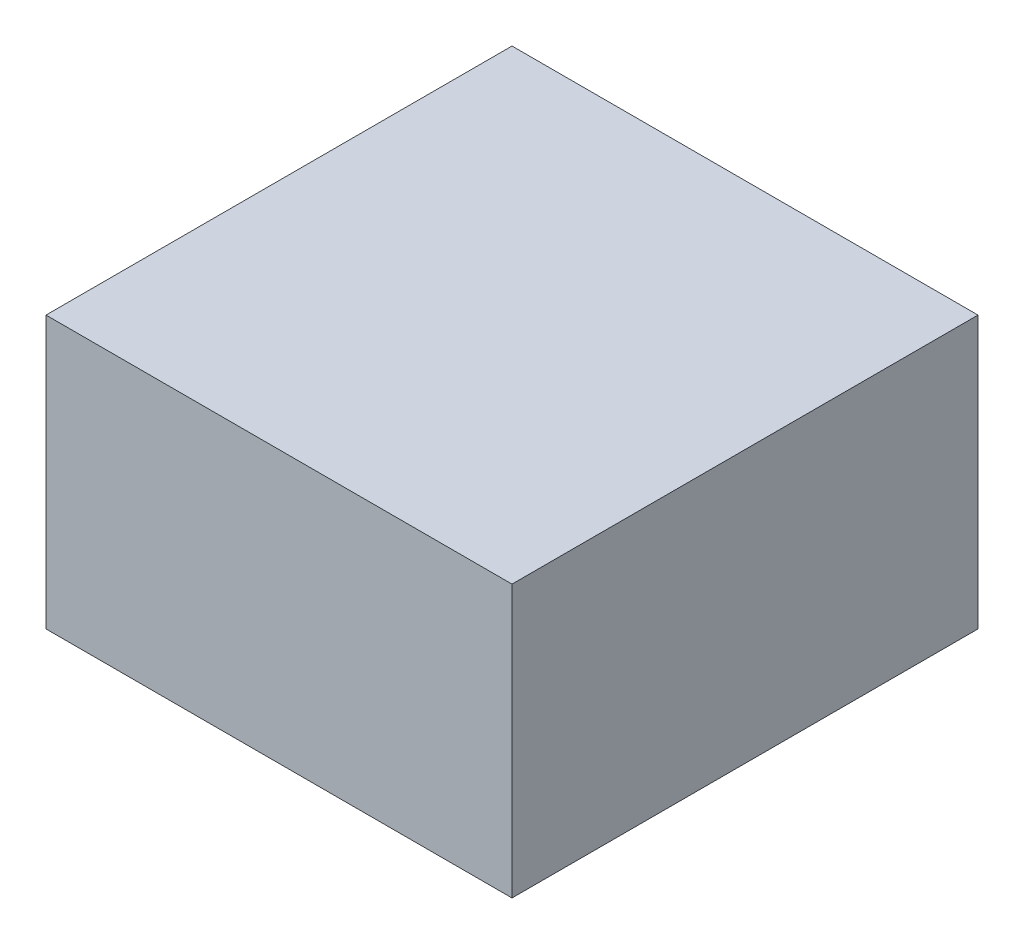
ISO-10303-21;
HEADER;
FILE_DESCRIPTION(('STEP AP214'),'2;1');
FILE_NAME('part.step','',(''),(''),'','','');
FILE_SCHEMA(('AUTOMOTIVE_DESIGN { 1 0 10303 214 1 1 1 1 }'));
ENDSEC;
DATA;
#1=APPLICATION_CONTEXT('core data for automotive mechanical design processes');
#2=APPLICATION_PROTOCOL_DEFINITION('international standard','automotive_design',2000,#1);
#3=PRODUCT_CONTEXT('',#1,'mechanical');
#4=PRODUCT('Part','Part','',(#3));
#5=PRODUCT_RELATED_PRODUCT_CATEGORY('part','',(#4));
#6=PRODUCT_DEFINITION_FORMATION('','',#4);
#7=PRODUCT_DEFINITION_CONTEXT('part definition',#1,'design');
#8=PRODUCT_DEFINITION('design','',#6,#7);
#9=PRODUCT_DEFINITION_SHAPE('','',#8);
#10=(LENGTH_UNIT() NAMED_UNIT(*) SI_UNIT(.MILLI.,.METRE.));
#11=(NAMED_UNIT(*) PLANE_ANGLE_UNIT() SI_UNIT($,.RADIAN.));
#12=(NAMED_UNIT(*) SI_UNIT($,.STERADIAN.) SOLID_ANGLE_UNIT());
#13=UNCERTAINTY_MEASURE_WITH_UNIT(LENGTH_MEASURE(1.E-05),#10,'distance_accuracy_value','');
#14=(GEOMETRIC_REPRESENTATION_CONTEXT(3) GLOBAL_UNCERTAINTY_ASSIGNED_CONTEXT((#13)) GLOBAL_UNIT_ASSIGNED_CONTEXT((#10,
#11,#12)) REPRESENTATION_CONTEXT('',''));
#15=CARTESIAN_POINT('',(0.,0.,0.));
#16=DIRECTION('',(0.,0.,1.));
#17=DIRECTION('',(1.,0.,0.));
#18=AXIS2_PLACEMENT_3D('',#15,#16,#17);
#19=CARTESIAN_POINT('',(30.,35.,30.));
#20=DIRECTION('',(-1.,0.,0.));
#21=DIRECTION('',(0.,0.,1.));
#22=AXIS2_PLACEMENT_3D('',#19,#20,#21);
#23=PLANE('',#22);
#24=DIRECTION('',(0.,0.,-1.));
#25=VECTOR('',#24,1.);
#26=CARTESIAN_POINT('',(30.,0.,30.));
#27=LINE('',#26,#25);
#28=CARTESIAN_POINT('',(30.,0.,30.));
#29=VERTEX_POINT('',#28);
#30=CARTESIAN_POINT('',(30.,0.,-30.));
#31=VERTEX_POINT('',#30);
#32=EDGE_CURVE('E104',#29,#31,#27,.T.);
#33=ORIENTED_EDGE('',*,*,#32,.T.);
#34=DIRECTION('',(0.,-1.,0.));
#35=VECTOR('',#34,1.);
#36=CARTESIAN_POINT('',(30.,35.,-30.));
#37=LINE('',#36,#35);
#38=CARTESIAN_POINT('',(30.,35.,-30.));
#39=VERTEX_POINT('',#38);
#40=EDGE_CURVE('E11',#39,#31,#37,.T.);
#41=ORIENTED_EDGE('',*,*,#40,.F.);
#42=DIRECTION('',(0.,0.,-1.));
#43=VECTOR('',#42,1.);
#44=CARTESIAN_POINT('',(30.,35.,30.));
#45=LINE('',#44,#43);
#46=CARTESIAN_POINT('',(30.,35.,30.));
#47=VERTEX_POINT('',#46);
#48=EDGE_CURVE('E92',#47,#39,#45,.T.);
#49=ORIENTED_EDGE('',*,*,#48,.F.);
#50=DIRECTION('',(0.,-1.,0.));
#51=VECTOR('',#50,1.);
#52=CARTESIAN_POINT('',(30.,35.,30.));
#53=LINE('',#52,#51);
#54=EDGE_CURVE('E100',#47,#29,#53,.T.);
#55=ORIENTED_EDGE('',*,*,#54,.T.);
#56=EDGE_LOOP('',(#33,#41,#49,#55));
#57=FACE_BOUND('',#56,.T.);
#58=ADVANCED_FACE('F41',(#57),#23,.F.);
#59=CARTESIAN_POINT('',(-30.,35.,-30.));
#60=DIRECTION('',(0.,0.,1.));
#61=DIRECTION('',(1.,0.,0.));
#62=AXIS2_PLACEMENT_3D('',#59,#60,#61);
#63=PLANE('',#62);
#64=DIRECTION('',(-1.,0.,0.));
#65=VECTOR('',#64,1.);
#66=CARTESIAN_POINT('',(-30.,0.,-30.));
#67=LINE('',#66,#65);
#68=CARTESIAN_POINT('',(-30.,0.,-30.));
#69=VERTEX_POINT('',#68);
#70=EDGE_CURVE('E96',#31,#69,#67,.T.);
#71=ORIENTED_EDGE('',*,*,#70,.T.);
#72=DIRECTION('',(0.,-1.,0.));
#73=VECTOR('',#72,1.);
#74=CARTESIAN_POINT('',(-30.,35.,-30.));
#75=LINE('',#74,#73);
#76=CARTESIAN_POINT('',(-30.,35.,-30.));
#77=VERTEX_POINT('',#76);
#78=EDGE_CURVE('E49',#77,#69,#75,.T.);
#79=ORIENTED_EDGE('',*,*,#78,.F.);
#80=DIRECTION('',(-1.,0.,0.));
#81=VECTOR('',#80,1.);
#82=CARTESIAN_POINT('',(-30.,35.,-30.));
#83=LINE('',#82,#81);
#84=EDGE_CURVE('E87',#39,#77,#83,.T.);
#85=ORIENTED_EDGE('',*,*,#84,.F.);
#86=ORIENTED_EDGE('',*,*,#40,.T.);
#87=EDGE_LOOP('',(#71,#79,#85,#86));
#88=FACE_BOUND('',#87,.T.);
#89=ADVANCED_FACE('F95',(#88),#63,.F.);
#90=CARTESIAN_POINT('',(-30.,35.,30.));
#91=DIRECTION('',(1.,0.,0.));
#92=DIRECTION('',(0.,0.,-1.));
#93=AXIS2_PLACEMENT_3D('',#90,#91,#92);
#94=PLANE('',#93);
#95=DIRECTION('',(0.,0.,1.));
#96=VECTOR('',#95,1.);
#97=CARTESIAN_POINT('',(-30.,0.,30.));
#98=LINE('',#97,#96);
#99=CARTESIAN_POINT('',(-30.,0.,30.));
#100=VERTEX_POINT('',#99);
#101=EDGE_CURVE('E74',#69,#100,#98,.T.);
#102=ORIENTED_EDGE('',*,*,#101,.T.);
#103=DIRECTION('',(0.,-1.,0.));
#104=VECTOR('',#103,1.);
#105=CARTESIAN_POINT('',(-30.,35.,30.));
#106=LINE('',#105,#104);
#107=CARTESIAN_POINT('',(-30.,35.,30.));
#108=VERTEX_POINT('',#107);
#109=EDGE_CURVE('E97',#108,#100,#106,.T.);
#110=ORIENTED_EDGE('',*,*,#109,.F.);
#111=DIRECTION('',(0.,0.,1.));
#112=VECTOR('',#111,1.);
#113=CARTESIAN_POINT('',(-30.,35.,30.));
#114=LINE('',#113,#112);
#115=EDGE_CURVE('E90',#77,#108,#114,.T.);
#116=ORIENTED_EDGE('',*,*,#115,.F.);
#117=ORIENTED_EDGE('',*,*,#78,.T.);
#118=EDGE_LOOP('',(#102,#110,#116,#117));
#119=FACE_BOUND('',#118,.T.);
#120=ADVANCED_FACE('F98',(#119),#94,.F.);
#121=CARTESIAN_POINT('',(-30.,35.,30.));
#122=DIRECTION('',(0.,0.,-1.));
#123=DIRECTION('',(-1.,0.,0.));
#124=AXIS2_PLACEMENT_3D('',#121,#122,#123);
#125=PLANE('',#124);
#126=DIRECTION('',(1.,0.,0.));
#127=VECTOR('',#126,1.);
#128=CARTESIAN_POINT('',(-30.,0.,30.));
#129=LINE('',#128,#127);
#130=EDGE_CURVE('E80',#100,#29,#129,.T.);
#131=ORIENTED_EDGE('',*,*,#130,.T.);
#132=ORIENTED_EDGE('',*,*,#54,.F.);
#133=DIRECTION('',(1.,0.,0.));
#134=VECTOR('',#133,1.);
#135=CARTESIAN_POINT('',(-30.,35.,30.));
#136=LINE('',#135,#134);
#137=EDGE_CURVE('E57',#108,#47,#136,.T.);
#138=ORIENTED_EDGE('',*,*,#137,.F.);
#139=ORIENTED_EDGE('',*,*,#109,.T.);
#140=EDGE_LOOP('',(#131,#132,#138,#139));
#141=FACE_BOUND('',#140,.T.);
#142=ADVANCED_FACE('F111',(#141),#125,.F.);
#143=CARTESIAN_POINT('',(0.,35.,0.));
#144=DIRECTION('',(0.,-1.,0.));
#145=DIRECTION('',(0.,0.,-1.));
#146=AXIS2_PLACEMENT_3D('',#143,#144,#145);
#147=PLANE('',#146);
#148=ORIENTED_EDGE('',*,*,#48,.T.);
#149=ORIENTED_EDGE('',*,*,#84,.T.);
#150=ORIENTED_EDGE('',*,*,#115,.T.);
#151=ORIENTED_EDGE('',*,*,#137,.T.);
#152=EDGE_LOOP('',(#148,#149,#150,#151));
#153=FACE_BOUND('',#152,.T.);
#154=ADVANCED_FACE('F88',(#153),#147,.F.);
#155=CARTESIAN_POINT('',(0.,0.,0.));
#156=DIRECTION('',(0.,-1.,0.));
#157=DIRECTION('',(0.,0.,-1.));
#158=AXIS2_PLACEMENT_3D('',#155,#156,#157);
#159=PLANE('',#158);
#160=ORIENTED_EDGE('',*,*,#32,.F.);
#161=ORIENTED_EDGE('',*,*,#130,.F.);
#162=ORIENTED_EDGE('',*,*,#101,.F.);
#163=ORIENTED_EDGE('',*,*,#70,.F.);
#164=EDGE_LOOP('',(#160,#161,#162,#163));
#165=FACE_BOUND('',#164,.T.);
#166=ADVANCED_FACE('F114',(#165),#159,.T.);
#167=CLOSED_SHELL('',(#58,#89,#120,#142,#154,#166));
#168=MANIFOLD_SOLID_BREP('B2',#167);
#169=ADVANCED_BREP_SHAPE_REPRESENTATION('',(#18,#168),#14);
#170=SHAPE_DEFINITION_REPRESENTATION(#9,#169);
ENDSEC;
END-ISO-10303-21;
